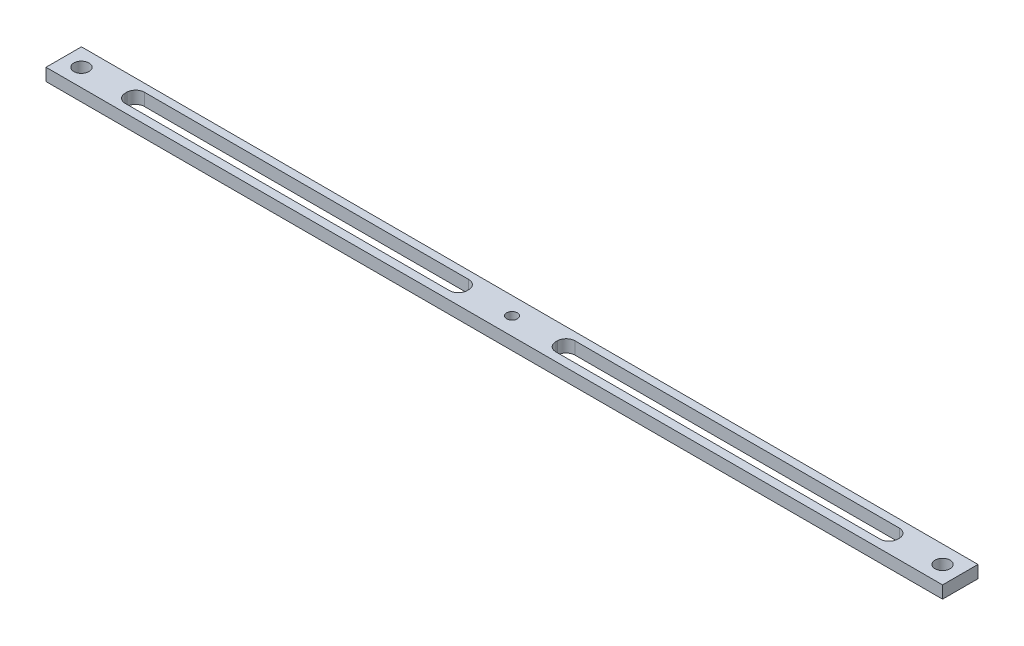
ISO-10303-21;
HEADER;
FILE_DESCRIPTION(('STEP AP214'),'2;1');
FILE_NAME('part.step','',(''),(''),'','','');
FILE_SCHEMA(('AUTOMOTIVE_DESIGN { 1 0 10303 214 1 1 1 1 }'));
ENDSEC;
DATA;
#1=APPLICATION_CONTEXT('core data for automotive mechanical design processes');
#2=APPLICATION_PROTOCOL_DEFINITION('international standard','automotive_design',2000,#1);
#3=PRODUCT_CONTEXT('',#1,'mechanical');
#4=PRODUCT('Part','Part','',(#3));
#5=PRODUCT_RELATED_PRODUCT_CATEGORY('part','',(#4));
#6=PRODUCT_DEFINITION_FORMATION('','',#4);
#7=PRODUCT_DEFINITION_CONTEXT('part definition',#1,'design');
#8=PRODUCT_DEFINITION('design','',#6,#7);
#9=PRODUCT_DEFINITION_SHAPE('','',#8);
#10=(LENGTH_UNIT() NAMED_UNIT(*) SI_UNIT(.MILLI.,.METRE.));
#11=(NAMED_UNIT(*) PLANE_ANGLE_UNIT() SI_UNIT($,.RADIAN.));
#12=(NAMED_UNIT(*) SI_UNIT($,.STERADIAN.) SOLID_ANGLE_UNIT());
#13=UNCERTAINTY_MEASURE_WITH_UNIT(LENGTH_MEASURE(1.E-05),#10,'distance_accuracy_value','');
#14=(GEOMETRIC_REPRESENTATION_CONTEXT(3) GLOBAL_UNCERTAINTY_ASSIGNED_CONTEXT((#13)) GLOBAL_UNIT_ASSIGNED_CONTEXT((#10,
#11,#12)) REPRESENTATION_CONTEXT('',''));
#15=CARTESIAN_POINT('',(0.,0.,0.));
#16=DIRECTION('',(0.,0.,1.));
#17=DIRECTION('',(1.,0.,0.));
#18=AXIS2_PLACEMENT_3D('',#15,#16,#17);
#19=CARTESIAN_POINT('',(0.,7.,0.));
#20=DIRECTION('',(0.,0.,-1.));
#21=DIRECTION('',(-1.,0.,0.));
#22=AXIS2_PLACEMENT_3D('',#19,#20,#21);
#23=PLANE('',#22);
#24=DIRECTION('',(1.,0.,0.));
#25=VECTOR('',#24,1.);
#26=CARTESIAN_POINT('',(0.,0.,0.));
#27=LINE('',#26,#25);
#28=CARTESIAN_POINT('',(0.,0.,0.));
#29=VERTEX_POINT('',#28);
#30=CARTESIAN_POINT('',(506.,0.,-1.21430643318376E-13));
#31=VERTEX_POINT('',#30);
#32=EDGE_CURVE('E266',#29,#31,#27,.T.);
#33=ORIENTED_EDGE('',*,*,#32,.T.);
#34=DIRECTION('',(0.,-1.,0.));
#35=VECTOR('',#34,1.);
#36=CARTESIAN_POINT('',(506.,7.,-1.21430643318376E-13));
#37=LINE('',#36,#35);
#38=CARTESIAN_POINT('',(506.,7.,-1.21430643318376E-13));
#39=VERTEX_POINT('',#38);
#40=EDGE_CURVE('E11',#39,#31,#37,.T.);
#41=ORIENTED_EDGE('',*,*,#40,.F.);
#42=DIRECTION('',(1.,0.,0.));
#43=VECTOR('',#42,1.);
#44=CARTESIAN_POINT('',(0.,7.,0.));
#45=LINE('',#44,#43);
#46=CARTESIAN_POINT('',(0.,7.,0.));
#47=VERTEX_POINT('',#46);
#48=EDGE_CURVE('E192',#47,#39,#45,.T.);
#49=ORIENTED_EDGE('',*,*,#48,.F.);
#50=DIRECTION('',(0.,-1.,0.));
#51=VECTOR('',#50,1.);
#52=CARTESIAN_POINT('',(0.,7.,0.));
#53=LINE('',#52,#51);
#54=EDGE_CURVE('E60',#47,#29,#53,.T.);
#55=ORIENTED_EDGE('',*,*,#54,.T.);
#56=EDGE_LOOP('',(#33,#41,#49,#55));
#57=FACE_BOUND('',#56,.T.);
#58=ADVANCED_FACE('F41',(#57),#23,.F.);
#59=CARTESIAN_POINT('',(506.,7.,0.));
#60=DIRECTION('',(-1.,0.,0.));
#61=DIRECTION('',(0.,0.,1.));
#62=AXIS2_PLACEMENT_3D('',#59,#60,#61);
#63=PLANE('',#62);
#64=DIRECTION('',(0.,0.,-1.));
#65=VECTOR('',#64,1.);
#66=CARTESIAN_POINT('',(506.,0.,0.));
#67=LINE('',#66,#65);
#68=CARTESIAN_POINT('',(506.,0.,-19.9999999999999));
#69=VERTEX_POINT('',#68);
#70=EDGE_CURVE('E198',#31,#69,#67,.T.);
#71=ORIENTED_EDGE('',*,*,#70,.T.);
#72=DIRECTION('',(0.,-1.,0.));
#73=VECTOR('',#72,1.);
#74=CARTESIAN_POINT('',(506.,7.,-19.9999999999999));
#75=LINE('',#74,#73);
#76=CARTESIAN_POINT('',(506.,7.,-19.9999999999999));
#77=VERTEX_POINT('',#76);
#78=EDGE_CURVE('E51',#77,#69,#75,.T.);
#79=ORIENTED_EDGE('',*,*,#78,.F.);
#80=DIRECTION('',(0.,0.,-1.));
#81=VECTOR('',#80,1.);
#82=CARTESIAN_POINT('',(506.,7.,0.));
#83=LINE('',#82,#81);
#84=EDGE_CURVE('E186',#39,#77,#83,.T.);
#85=ORIENTED_EDGE('',*,*,#84,.F.);
#86=ORIENTED_EDGE('',*,*,#40,.T.);
#87=EDGE_LOOP('',(#71,#79,#85,#86));
#88=FACE_BOUND('',#87,.T.);
#89=ADVANCED_FACE('F197',(#88),#63,.F.);
#90=CARTESIAN_POINT('',(0.,7.,-20.));
#91=DIRECTION('',(0.,0.,-1.));
#92=DIRECTION('',(-1.,0.,0.));
#93=AXIS2_PLACEMENT_3D('',#90,#91,#92);
#94=PLANE('',#93);
#95=DIRECTION('',(1.,0.,0.));
#96=VECTOR('',#95,1.);
#97=CARTESIAN_POINT('',(0.,0.,-20.));
#98=LINE('',#97,#96);
#99=CARTESIAN_POINT('',(0.,0.,-20.));
#100=VERTEX_POINT('',#99);
#101=EDGE_CURVE('E269',#100,#69,#98,.T.);
#102=ORIENTED_EDGE('',*,*,#101,.F.);
#103=DIRECTION('',(0.,-1.,0.));
#104=VECTOR('',#103,1.);
#105=CARTESIAN_POINT('',(0.,7.,-20.));
#106=LINE('',#105,#104);
#107=CARTESIAN_POINT('',(0.,7.,-20.));
#108=VERTEX_POINT('',#107);
#109=EDGE_CURVE('E122',#108,#100,#106,.T.);
#110=ORIENTED_EDGE('',*,*,#109,.F.);
#111=DIRECTION('',(1.,0.,0.));
#112=VECTOR('',#111,1.);
#113=CARTESIAN_POINT('',(0.,7.,-20.));
#114=LINE('',#113,#112);
#115=EDGE_CURVE('E191',#108,#77,#114,.T.);
#116=ORIENTED_EDGE('',*,*,#115,.T.);
#117=ORIENTED_EDGE('',*,*,#78,.T.);
#118=EDGE_LOOP('',(#102,#110,#116,#117));
#119=FACE_BOUND('',#118,.T.);
#120=ADVANCED_FACE('F202',(#119),#94,.T.);
#121=CARTESIAN_POINT('',(283.,7.,-10.574576279988));
#122=DIRECTION('',(0.,-1.,0.));
#123=DIRECTION('',(0.,0.,-1.));
#124=AXIS2_PLACEMENT_3D('',#121,#122,#123);
#125=CYLINDRICAL_SURFACE('',#124,5.);
#126=CARTESIAN_POINT('',(283.,0.,-10.574576279988));
#127=DIRECTION('',(0.,1.,0.));
#128=DIRECTION('',(0.,0.,1.));
#129=AXIS2_PLACEMENT_3D('',#126,#127,#128);
#130=CIRCLE('',#129,5.);
#131=CARTESIAN_POINT('',(283.,0.,-15.574576279988));
#132=VERTEX_POINT('',#131);
#133=CARTESIAN_POINT('',(278.,0.,-10.574576279988));
#134=VERTEX_POINT('',#133);
#135=EDGE_CURVE('E242',#132,#134,#130,.T.);
#136=ORIENTED_EDGE('',*,*,#135,.F.);
#137=DIRECTION('',(0.,-1.,0.));
#138=VECTOR('',#137,1.);
#139=CARTESIAN_POINT('',(283.,7.,-15.574576279988));
#140=LINE('',#139,#138);
#141=CARTESIAN_POINT('',(283.,7.,-15.574576279988));
#142=VERTEX_POINT('',#141);
#143=EDGE_CURVE('E276',#142,#132,#140,.T.);
#144=ORIENTED_EDGE('',*,*,#143,.F.);
#145=CARTESIAN_POINT('',(283.,7.,-10.574576279988));
#146=DIRECTION('',(0.,1.,0.));
#147=DIRECTION('',(0.,0.,1.));
#148=AXIS2_PLACEMENT_3D('',#145,#146,#147);
#149=CIRCLE('',#148,5.);
#150=CARTESIAN_POINT('',(278.,7.,-10.574576279988));
#151=VERTEX_POINT('',#150);
#152=EDGE_CURVE('E362',#142,#151,#149,.T.);
#153=ORIENTED_EDGE('',*,*,#152,.T.);
#154=DIRECTION('',(0.,-1.,0.));
#155=VECTOR('',#154,1.);
#156=CARTESIAN_POINT('',(278.,7.,-10.574576279988));
#157=LINE('',#156,#155);
#158=EDGE_CURVE('E278',#151,#134,#157,.T.);
#159=ORIENTED_EDGE('',*,*,#158,.T.);
#160=EDGE_LOOP('',(#136,#144,#153,#159));
#161=FACE_BOUND('',#160,.T.);
#162=ADVANCED_FACE('F399',(#161),#125,.F.);
#163=CARTESIAN_POINT('',(0.,7.,-15.574576279988));
#164=DIRECTION('',(0.,0.,-1.));
#165=DIRECTION('',(-1.,0.,0.));
#166=AXIS2_PLACEMENT_3D('',#163,#164,#165);
#167=PLANE('',#166);
#168=DIRECTION('',(1.,0.,0.));
#169=VECTOR('',#168,1.);
#170=CARTESIAN_POINT('',(0.,0.,-15.574576279988));
#171=LINE('',#170,#169);
#172=CARTESIAN_POINT('',(466.,0.,-15.574576279988));
#173=VERTEX_POINT('',#172);
#174=EDGE_CURVE('E245',#132,#173,#171,.T.);
#175=ORIENTED_EDGE('',*,*,#174,.T.);
#176=DIRECTION('',(0.,-1.,0.));
#177=VECTOR('',#176,1.);
#178=CARTESIAN_POINT('',(466.,7.,-15.574576279988));
#179=LINE('',#178,#177);
#180=CARTESIAN_POINT('',(466.,7.,-15.574576279988));
#181=VERTEX_POINT('',#180);
#182=EDGE_CURVE('E290',#181,#173,#179,.T.);
#183=ORIENTED_EDGE('',*,*,#182,.F.);
#184=DIRECTION('',(1.,0.,0.));
#185=VECTOR('',#184,1.);
#186=CARTESIAN_POINT('',(0.,7.,-15.574576279988));
#187=LINE('',#186,#185);
#188=EDGE_CURVE('E365',#142,#181,#187,.T.);
#189=ORIENTED_EDGE('',*,*,#188,.F.);
#190=ORIENTED_EDGE('',*,*,#143,.T.);
#191=EDGE_LOOP('',(#175,#183,#189,#190));
#192=FACE_BOUND('',#191,.T.);
#193=ADVANCED_FACE('F403',(#192),#167,.F.);
#194=CARTESIAN_POINT('',(466.,7.,-10.574576279988));
#195=DIRECTION('',(0.,-1.,0.));
#196=DIRECTION('',(0.,0.,-1.));
#197=AXIS2_PLACEMENT_3D('',#194,#195,#196);
#198=CYLINDRICAL_SURFACE('',#197,5.);
#199=CARTESIAN_POINT('',(466.,0.,-10.574576279988));
#200=DIRECTION('',(0.,1.,0.));
#201=DIRECTION('',(0.,0.,1.));
#202=AXIS2_PLACEMENT_3D('',#199,#200,#201);
#203=CIRCLE('',#202,5.);
#204=CARTESIAN_POINT('',(471.,0.,-10.574576279988));
#205=VERTEX_POINT('',#204);
#206=EDGE_CURVE('E248',#205,#173,#203,.T.);
#207=ORIENTED_EDGE('',*,*,#206,.F.);
#208=DIRECTION('',(0.,-1.,0.));
#209=VECTOR('',#208,1.);
#210=CARTESIAN_POINT('',(471.,7.,-10.574576279988));
#211=LINE('',#210,#209);
#212=CARTESIAN_POINT('',(471.,7.,-10.574576279988));
#213=VERTEX_POINT('',#212);
#214=EDGE_CURVE('E288',#213,#205,#211,.T.);
#215=ORIENTED_EDGE('',*,*,#214,.F.);
#216=CARTESIAN_POINT('',(466.,7.,-10.574576279988));
#217=DIRECTION('',(0.,1.,0.));
#218=DIRECTION('',(0.,0.,1.));
#219=AXIS2_PLACEMENT_3D('',#216,#217,#218);
#220=CIRCLE('',#219,5.);
#221=EDGE_CURVE('E367',#213,#181,#220,.T.);
#222=ORIENTED_EDGE('',*,*,#221,.T.);
#223=ORIENTED_EDGE('',*,*,#182,.T.);
#224=EDGE_LOOP('',(#207,#215,#222,#223));
#225=FACE_BOUND('',#224,.T.);
#226=ADVANCED_FACE('F409',(#225),#198,.F.);
#227=CARTESIAN_POINT('',(471.,7.,0.));
#228=DIRECTION('',(1.,0.,0.));
#229=DIRECTION('',(0.,0.,-1.));
#230=AXIS2_PLACEMENT_3D('',#227,#228,#229);
#231=PLANE('',#230);
#232=DIRECTION('',(0.,0.,1.));
#233=VECTOR('',#232,1.);
#234=CARTESIAN_POINT('',(471.,0.,0.));
#235=LINE('',#234,#233);
#236=CARTESIAN_POINT('',(471.,0.,-9.75277634577939));
#237=VERTEX_POINT('',#236);
#238=EDGE_CURVE('E251',#205,#237,#235,.T.);
#239=ORIENTED_EDGE('',*,*,#238,.T.);
#240=DIRECTION('',(0.,-1.,0.));
#241=VECTOR('',#240,1.);
#242=CARTESIAN_POINT('',(471.,7.,-9.75277634577939));
#243=LINE('',#242,#241);
#244=CARTESIAN_POINT('',(471.,7.,-9.75277634577939));
#245=VERTEX_POINT('',#244);
#246=EDGE_CURVE('E286',#245,#237,#243,.T.);
#247=ORIENTED_EDGE('',*,*,#246,.F.);
#248=DIRECTION('',(0.,0.,1.));
#249=VECTOR('',#248,1.);
#250=CARTESIAN_POINT('',(471.,7.,0.));
#251=LINE('',#250,#249);
#252=EDGE_CURVE('E370',#213,#245,#251,.T.);
#253=ORIENTED_EDGE('',*,*,#252,.F.);
#254=ORIENTED_EDGE('',*,*,#214,.T.);
#255=EDGE_LOOP('',(#239,#247,#253,#254));
#256=FACE_BOUND('',#255,.T.);
#257=ADVANCED_FACE('F412',(#256),#231,.F.);
#258=CARTESIAN_POINT('',(466.,7.,-9.75277634577939));
#259=DIRECTION('',(0.,-1.,0.));
#260=DIRECTION('',(0.,0.,-1.));
#261=AXIS2_PLACEMENT_3D('',#258,#259,#260);
#262=CYLINDRICAL_SURFACE('',#261,5.);
#263=CARTESIAN_POINT('',(466.,0.,-9.75277634577939));
#264=DIRECTION('',(0.,1.,0.));
#265=DIRECTION('',(0.,0.,1.));
#266=AXIS2_PLACEMENT_3D('',#263,#264,#265);
#267=CIRCLE('',#266,5.);
#268=CARTESIAN_POINT('',(466.,0.,-4.75277634577939));
#269=VERTEX_POINT('',#268);
#270=EDGE_CURVE('E254',#269,#237,#267,.T.);
#271=ORIENTED_EDGE('',*,*,#270,.F.);
#272=DIRECTION('',(0.,-1.,0.));
#273=VECTOR('',#272,1.);
#274=CARTESIAN_POINT('',(466.,7.,-4.75277634577939));
#275=LINE('',#274,#273);
#276=CARTESIAN_POINT('',(466.,7.,-4.75277634577939));
#277=VERTEX_POINT('',#276);
#278=EDGE_CURVE('E284',#277,#269,#275,.T.);
#279=ORIENTED_EDGE('',*,*,#278,.F.);
#280=CARTESIAN_POINT('',(466.,7.,-9.75277634577939));
#281=DIRECTION('',(0.,1.,0.));
#282=DIRECTION('',(0.,0.,1.));
#283=AXIS2_PLACEMENT_3D('',#280,#281,#282);
#284=CIRCLE('',#283,5.);
#285=EDGE_CURVE('E372',#277,#245,#284,.T.);
#286=ORIENTED_EDGE('',*,*,#285,.T.);
#287=ORIENTED_EDGE('',*,*,#246,.T.);
#288=EDGE_LOOP('',(#271,#279,#286,#287));
#289=FACE_BOUND('',#288,.T.);
#290=ADVANCED_FACE('F415',(#289),#262,.F.);
#291=CARTESIAN_POINT('',(0.,7.,-4.75277634577941));
#292=DIRECTION('',(0.,0.,-1.));
#293=DIRECTION('',(-1.,0.,0.));
#294=AXIS2_PLACEMENT_3D('',#291,#292,#293);
#295=PLANE('',#294);
#296=DIRECTION('',(1.,0.,0.));
#297=VECTOR('',#296,1.);
#298=CARTESIAN_POINT('',(0.,0.,-4.75277634577941));
#299=LINE('',#298,#297);
#300=CARTESIAN_POINT('',(283.,0.,-4.7527763457794));
#301=VERTEX_POINT('',#300);
#302=EDGE_CURVE('E257',#301,#269,#299,.T.);
#303=ORIENTED_EDGE('',*,*,#302,.F.);
#304=DIRECTION('',(0.,-1.,0.));
#305=VECTOR('',#304,1.);
#306=CARTESIAN_POINT('',(283.,7.,-4.7527763457794));
#307=LINE('',#306,#305);
#308=CARTESIAN_POINT('',(283.,7.,-4.7527763457794));
#309=VERTEX_POINT('',#308);
#310=EDGE_CURVE('E282',#309,#301,#307,.T.);
#311=ORIENTED_EDGE('',*,*,#310,.F.);
#312=DIRECTION('',(1.,0.,0.));
#313=VECTOR('',#312,1.);
#314=CARTESIAN_POINT('',(0.,7.,-4.75277634577941));
#315=LINE('',#314,#313);
#316=EDGE_CURVE('E375',#309,#277,#315,.T.);
#317=ORIENTED_EDGE('',*,*,#316,.T.);
#318=ORIENTED_EDGE('',*,*,#278,.T.);
#319=EDGE_LOOP('',(#303,#311,#317,#318));
#320=FACE_BOUND('',#319,.T.);
#321=ADVANCED_FACE('F417',(#320),#295,.T.);
#322=CARTESIAN_POINT('',(283.,7.,-9.7527763457794));
#323=DIRECTION('',(0.,-1.,0.));
#324=DIRECTION('',(0.,0.,-1.));
#325=AXIS2_PLACEMENT_3D('',#322,#323,#324);
#326=CYLINDRICAL_SURFACE('',#325,5.);
#327=CARTESIAN_POINT('',(283.,0.,-9.7527763457794));
#328=DIRECTION('',(0.,1.,0.));
#329=DIRECTION('',(0.,0.,1.));
#330=AXIS2_PLACEMENT_3D('',#327,#328,#329);
#331=CIRCLE('',#330,5.);
#332=CARTESIAN_POINT('',(278.,0.,-9.7527763457794));
#333=VERTEX_POINT('',#332);
#334=EDGE_CURVE('E260',#301,#333,#331,.F.);
#335=ORIENTED_EDGE('',*,*,#334,.T.);
#336=DIRECTION('',(0.,-1.,0.));
#337=VECTOR('',#336,1.);
#338=CARTESIAN_POINT('',(278.,7.,-9.7527763457794));
#339=LINE('',#338,#337);
#340=CARTESIAN_POINT('',(278.,7.,-9.7527763457794));
#341=VERTEX_POINT('',#340);
#342=EDGE_CURVE('E280',#341,#333,#339,.T.);
#343=ORIENTED_EDGE('',*,*,#342,.F.);
#344=CARTESIAN_POINT('',(283.,7.,-9.7527763457794));
#345=DIRECTION('',(0.,1.,0.));
#346=DIRECTION('',(0.,0.,1.));
#347=AXIS2_PLACEMENT_3D('',#344,#345,#346);
#348=CIRCLE('',#347,5.);
#349=EDGE_CURVE('E378',#309,#341,#348,.F.);
#350=ORIENTED_EDGE('',*,*,#349,.F.);
#351=ORIENTED_EDGE('',*,*,#310,.T.);
#352=EDGE_LOOP('',(#335,#343,#350,#351));
#353=FACE_BOUND('',#352,.T.);
#354=ADVANCED_FACE('F392',(#353),#326,.F.);
#355=CARTESIAN_POINT('',(40.,7.,-10.5745762799879));
#356=DIRECTION('',(0.,-1.,0.));
#357=DIRECTION('',(0.,0.,-1.));
#358=AXIS2_PLACEMENT_3D('',#355,#356,#357);
#359=CYLINDRICAL_SURFACE('',#358,4.99999999999999);
#360=CARTESIAN_POINT('',(40.,0.,-10.5745762799879));
#361=DIRECTION('',(0.,1.,0.));
#362=DIRECTION('',(0.,0.,1.));
#363=AXIS2_PLACEMENT_3D('',#360,#361,#362);
#364=CIRCLE('',#363,4.99999999999999);
#365=CARTESIAN_POINT('',(40.,0.,-15.5745762799879));
#366=VERTEX_POINT('',#365);
#367=CARTESIAN_POINT('',(35.,0.,-10.5745762799879));
#368=VERTEX_POINT('',#367);
#369=EDGE_CURVE('E218',#366,#368,#364,.T.);
#370=ORIENTED_EDGE('',*,*,#369,.F.);
#371=DIRECTION('',(0.,-1.,0.));
#372=VECTOR('',#371,1.);
#373=CARTESIAN_POINT('',(40.,7.,-15.5745762799879));
#374=LINE('',#373,#372);
#375=CARTESIAN_POINT('',(40.,7.,-15.5745762799879));
#376=VERTEX_POINT('',#375);
#377=EDGE_CURVE('E45',#376,#366,#374,.T.);
#378=ORIENTED_EDGE('',*,*,#377,.F.);
#379=CARTESIAN_POINT('',(40.,7.,-10.5745762799879));
#380=DIRECTION('',(0.,1.,0.));
#381=DIRECTION('',(0.,0.,1.));
#382=AXIS2_PLACEMENT_3D('',#379,#380,#381);
#383=CIRCLE('',#382,4.99999999999999);
#384=CARTESIAN_POINT('',(35.,7.,-10.5745762799879));
#385=VERTEX_POINT('',#384);
#386=EDGE_CURVE('E319',#376,#385,#383,.T.);
#387=ORIENTED_EDGE('',*,*,#386,.T.);
#388=DIRECTION('',(0.,-1.,0.));
#389=VECTOR('',#388,1.);
#390=CARTESIAN_POINT('',(35.,7.,-10.5745762799879));
#391=LINE('',#390,#389);
#392=EDGE_CURVE('E205',#385,#368,#391,.T.);
#393=ORIENTED_EDGE('',*,*,#392,.T.);
#394=EDGE_LOOP('',(#370,#378,#387,#393));
#395=FACE_BOUND('',#394,.T.);
#396=ADVANCED_FACE('F318',(#395),#359,.F.);
#397=CARTESIAN_POINT('',(0.,7.,-15.5745762799879));
#398=DIRECTION('',(0.,0.,-1.));
#399=DIRECTION('',(-1.,0.,0.));
#400=AXIS2_PLACEMENT_3D('',#397,#398,#399);
#401=PLANE('',#400);
#402=DIRECTION('',(1.,0.,0.));
#403=VECTOR('',#402,1.);
#404=CARTESIAN_POINT('',(0.,0.,-15.5745762799879));
#405=LINE('',#404,#403);
#406=CARTESIAN_POINT('',(223.,0.,-15.5745762799879));
#407=VERTEX_POINT('',#406);
#408=EDGE_CURVE('E221',#366,#407,#405,.T.);
#409=ORIENTED_EDGE('',*,*,#408,.T.);
#410=DIRECTION('',(0.,-1.,0.));
#411=VECTOR('',#410,1.);
#412=CARTESIAN_POINT('',(223.,7.,-15.5745762799879));
#413=LINE('',#412,#411);
#414=CARTESIAN_POINT('',(223.,7.,-15.5745762799879));
#415=VERTEX_POINT('',#414);
#416=EDGE_CURVE('E303',#415,#407,#413,.T.);
#417=ORIENTED_EDGE('',*,*,#416,.F.);
#418=DIRECTION('',(1.,0.,0.));
#419=VECTOR('',#418,1.);
#420=CARTESIAN_POINT('',(0.,7.,-15.5745762799879));
#421=LINE('',#420,#419);
#422=EDGE_CURVE('E311',#376,#415,#421,.T.);
#423=ORIENTED_EDGE('',*,*,#422,.F.);
#424=ORIENTED_EDGE('',*,*,#377,.T.);
#425=EDGE_LOOP('',(#409,#417,#423,#424));
#426=FACE_BOUND('',#425,.T.);
#427=ADVANCED_FACE('F310',(#426),#401,.F.);
#428=CARTESIAN_POINT('',(223.,7.,-10.5745762799879));
#429=DIRECTION('',(0.,-1.,0.));
#430=DIRECTION('',(0.,0.,-1.));
#431=AXIS2_PLACEMENT_3D('',#428,#429,#430);
#432=CYLINDRICAL_SURFACE('',#431,5.);
#433=CARTESIAN_POINT('',(223.,0.,-10.5745762799879));
#434=DIRECTION('',(0.,1.,0.));
#435=DIRECTION('',(0.,0.,1.));
#436=AXIS2_PLACEMENT_3D('',#433,#434,#435);
#437=CIRCLE('',#436,5.);
#438=CARTESIAN_POINT('',(228.,0.,-10.5745762799879));
#439=VERTEX_POINT('',#438);
#440=EDGE_CURVE('E224',#439,#407,#437,.T.);
#441=ORIENTED_EDGE('',*,*,#440,.F.);
#442=DIRECTION('',(0.,-1.,0.));
#443=VECTOR('',#442,1.);
#444=CARTESIAN_POINT('',(228.,7.,-10.5745762799879));
#445=LINE('',#444,#443);
#446=CARTESIAN_POINT('',(228.,7.,-10.5745762799879));
#447=VERTEX_POINT('',#446);
#448=EDGE_CURVE('E302',#447,#439,#445,.T.);
#449=ORIENTED_EDGE('',*,*,#448,.F.);
#450=CARTESIAN_POINT('',(223.,7.,-10.5745762799879));
#451=DIRECTION('',(0.,1.,0.));
#452=DIRECTION('',(0.,0.,1.));
#453=AXIS2_PLACEMENT_3D('',#450,#451,#452);
#454=CIRCLE('',#453,5.);
#455=EDGE_CURVE('E347',#447,#415,#454,.T.);
#456=ORIENTED_EDGE('',*,*,#455,.T.);
#457=ORIENTED_EDGE('',*,*,#416,.T.);
#458=EDGE_LOOP('',(#441,#449,#456,#457));
#459=FACE_BOUND('',#458,.T.);
#460=ADVANCED_FACE('F344',(#459),#432,.F.);
#461=CARTESIAN_POINT('',(228.,7.,7.20877313155194E-12));
#462=DIRECTION('',(1.,0.,0.));
#463=DIRECTION('',(0.,0.,-1.));
#464=AXIS2_PLACEMENT_3D('',#461,#462,#463);
#465=PLANE('',#464);
#466=DIRECTION('',(0.,0.,1.));
#467=VECTOR('',#466,1.);
#468=CARTESIAN_POINT('',(228.,0.,7.20877313155194E-12));
#469=LINE('',#468,#467);
#470=CARTESIAN_POINT('',(228.,0.,-9.69671937911455));
#471=VERTEX_POINT('',#470);
#472=EDGE_CURVE('E227',#439,#471,#469,.T.);
#473=ORIENTED_EDGE('',*,*,#472,.T.);
#474=DIRECTION('',(0.,-1.,0.));
#475=VECTOR('',#474,1.);
#476=CARTESIAN_POINT('',(228.,7.,-9.69671937911455));
#477=LINE('',#476,#475);
#478=CARTESIAN_POINT('',(228.,7.,-9.69671937911455));
#479=VERTEX_POINT('',#478);
#480=EDGE_CURVE('E300',#479,#471,#477,.T.);
#481=ORIENTED_EDGE('',*,*,#480,.F.);
#482=DIRECTION('',(0.,0.,1.));
#483=VECTOR('',#482,1.);
#484=CARTESIAN_POINT('',(228.,7.,7.20877313155194E-12));
#485=LINE('',#484,#483);
#486=EDGE_CURVE('E348',#447,#479,#485,.T.);
#487=ORIENTED_EDGE('',*,*,#486,.F.);
#488=ORIENTED_EDGE('',*,*,#448,.T.);
#489=EDGE_LOOP('',(#473,#481,#487,#488));
#490=FACE_BOUND('',#489,.T.);
#491=ADVANCED_FACE('F349',(#490),#465,.F.);
#492=CARTESIAN_POINT('',(223.,7.,-9.69671937911455));
#493=DIRECTION('',(0.,-1.,0.));
#494=DIRECTION('',(0.,0.,-1.));
#495=AXIS2_PLACEMENT_3D('',#492,#493,#494);
#496=CYLINDRICAL_SURFACE('',#495,5.);
#497=CARTESIAN_POINT('',(223.,0.,-9.69671937911455));
#498=DIRECTION('',(0.,1.,0.));
#499=DIRECTION('',(0.,0.,1.));
#500=AXIS2_PLACEMENT_3D('',#497,#498,#499);
#501=CIRCLE('',#500,5.);
#502=CARTESIAN_POINT('',(223.,0.,-4.69671937911455));
#503=VERTEX_POINT('',#502);
#504=EDGE_CURVE('E230',#503,#471,#501,.T.);
#505=ORIENTED_EDGE('',*,*,#504,.F.);
#506=DIRECTION('',(0.,-1.,0.));
#507=VECTOR('',#506,1.);
#508=CARTESIAN_POINT('',(223.,7.,-4.69671937911455));
#509=LINE('',#508,#507);
#510=CARTESIAN_POINT('',(223.,7.,-4.69671937911455));
#511=VERTEX_POINT('',#510);
#512=EDGE_CURVE('E298',#511,#503,#509,.T.);
#513=ORIENTED_EDGE('',*,*,#512,.F.);
#514=CARTESIAN_POINT('',(223.,7.,-9.69671937911455));
#515=DIRECTION('',(0.,1.,0.));
#516=DIRECTION('',(0.,0.,1.));
#517=AXIS2_PLACEMENT_3D('',#514,#515,#516);
#518=CIRCLE('',#517,5.);
#519=EDGE_CURVE('E351',#511,#479,#518,.T.);
#520=ORIENTED_EDGE('',*,*,#519,.T.);
#521=ORIENTED_EDGE('',*,*,#480,.T.);
#522=EDGE_LOOP('',(#505,#513,#520,#521));
#523=FACE_BOUND('',#522,.T.);
#524=ADVANCED_FACE('F341',(#523),#496,.F.);
#525=CARTESIAN_POINT('',(0.,7.,-4.69671937911455));
#526=DIRECTION('',(0.,0.,-1.));
#527=DIRECTION('',(-1.,0.,0.));
#528=AXIS2_PLACEMENT_3D('',#525,#526,#527);
#529=PLANE('',#528);
#530=DIRECTION('',(1.,0.,0.));
#531=VECTOR('',#530,1.);
#532=CARTESIAN_POINT('',(0.,0.,-4.69671937911455));
#533=LINE('',#532,#531);
#534=CARTESIAN_POINT('',(40.,0.,-4.69671937911455));
#535=VERTEX_POINT('',#534);
#536=EDGE_CURVE('E233',#535,#503,#533,.T.);
#537=ORIENTED_EDGE('',*,*,#536,.F.);
#538=DIRECTION('',(0.,-1.,0.));
#539=VECTOR('',#538,1.);
#540=CARTESIAN_POINT('',(40.,7.,-4.69671937911455));
#541=LINE('',#540,#539);
#542=CARTESIAN_POINT('',(40.,7.,-4.69671937911455));
#543=VERTEX_POINT('',#542);
#544=EDGE_CURVE('E296',#543,#535,#541,.T.);
#545=ORIENTED_EDGE('',*,*,#544,.F.);
#546=DIRECTION('',(1.,0.,0.));
#547=VECTOR('',#546,1.);
#548=CARTESIAN_POINT('',(0.,7.,-4.69671937911455));
#549=LINE('',#548,#547);
#550=EDGE_CURVE('E337',#543,#511,#549,.T.);
#551=ORIENTED_EDGE('',*,*,#550,.T.);
#552=ORIENTED_EDGE('',*,*,#512,.T.);
#553=EDGE_LOOP('',(#537,#545,#551,#552));
#554=FACE_BOUND('',#553,.T.);
#555=ADVANCED_FACE('F335',(#554),#529,.T.);
#556=CARTESIAN_POINT('',(40.,7.,-9.69671937911455));
#557=DIRECTION('',(0.,-1.,0.));
#558=DIRECTION('',(0.,0.,-1.));
#559=AXIS2_PLACEMENT_3D('',#556,#557,#558);
#560=CYLINDRICAL_SURFACE('',#559,5.);
#561=CARTESIAN_POINT('',(40.,0.,-9.69671937911455));
#562=DIRECTION('',(0.,1.,0.));
#563=DIRECTION('',(0.,0.,1.));
#564=AXIS2_PLACEMENT_3D('',#561,#562,#563);
#565=CIRCLE('',#564,5.);
#566=CARTESIAN_POINT('',(35.,0.,-9.69671937911455));
#567=VERTEX_POINT('',#566);
#568=EDGE_CURVE('E236',#567,#535,#565,.T.);
#569=ORIENTED_EDGE('',*,*,#568,.F.);
#570=DIRECTION('',(0.,-1.,0.));
#571=VECTOR('',#570,1.);
#572=CARTESIAN_POINT('',(35.,7.,-9.69671937911455));
#573=LINE('',#572,#571);
#574=CARTESIAN_POINT('',(35.,7.,-9.69671937911455));
#575=VERTEX_POINT('',#574);
#576=EDGE_CURVE('E294',#575,#567,#573,.T.);
#577=ORIENTED_EDGE('',*,*,#576,.F.);
#578=CARTESIAN_POINT('',(40.,7.,-9.69671937911455));
#579=DIRECTION('',(0.,1.,0.));
#580=DIRECTION('',(0.,0.,1.));
#581=AXIS2_PLACEMENT_3D('',#578,#579,#580);
#582=CIRCLE('',#581,5.);
#583=EDGE_CURVE('E331',#575,#543,#582,.T.);
#584=ORIENTED_EDGE('',*,*,#583,.T.);
#585=ORIENTED_EDGE('',*,*,#544,.T.);
#586=EDGE_LOOP('',(#569,#577,#584,#585));
#587=FACE_BOUND('',#586,.T.);
#588=ADVANCED_FACE('F328',(#587),#560,.F.);
#589=CARTESIAN_POINT('',(278.,7.,0.));
#590=DIRECTION('',(1.,0.,0.));
#591=DIRECTION('',(0.,0.,-1.));
#592=AXIS2_PLACEMENT_3D('',#589,#590,#591);
#593=PLANE('',#592);
#594=DIRECTION('',(0.,0.,1.));
#595=VECTOR('',#594,1.);
#596=CARTESIAN_POINT('',(278.,0.,0.));
#597=LINE('',#596,#595);
#598=EDGE_CURVE('E263',#134,#333,#597,.T.);
#599=ORIENTED_EDGE('',*,*,#598,.F.);
#600=ORIENTED_EDGE('',*,*,#158,.F.);
#601=DIRECTION('',(0.,0.,1.));
#602=VECTOR('',#601,1.);
#603=CARTESIAN_POINT('',(278.,7.,0.));
#604=LINE('',#603,#602);
#605=EDGE_CURVE('E380',#151,#341,#604,.T.);
#606=ORIENTED_EDGE('',*,*,#605,.T.);
#607=ORIENTED_EDGE('',*,*,#342,.T.);
#608=EDGE_LOOP('',(#599,#600,#606,#607));
#609=FACE_BOUND('',#608,.T.);
#610=ADVANCED_FACE('F385',(#609),#593,.T.);
#611=CARTESIAN_POINT('',(35.,7.,0.));
#612=DIRECTION('',(1.,0.,0.));
#613=DIRECTION('',(0.,0.,-1.));
#614=AXIS2_PLACEMENT_3D('',#611,#612,#613);
#615=PLANE('',#614);
#616=DIRECTION('',(0.,0.,1.));
#617=VECTOR('',#616,1.);
#618=CARTESIAN_POINT('',(35.,0.,0.));
#619=LINE('',#618,#617);
#620=EDGE_CURVE('E239',#368,#567,#619,.T.);
#621=ORIENTED_EDGE('',*,*,#620,.F.);
#622=ORIENTED_EDGE('',*,*,#392,.F.);
#623=DIRECTION('',(0.,0.,1.));
#624=VECTOR('',#623,1.);
#625=CARTESIAN_POINT('',(35.,7.,0.));
#626=LINE('',#625,#624);
#627=EDGE_CURVE('E324',#385,#575,#626,.T.);
#628=ORIENTED_EDGE('',*,*,#627,.T.);
#629=ORIENTED_EDGE('',*,*,#576,.T.);
#630=EDGE_LOOP('',(#621,#622,#628,#629));
#631=FACE_BOUND('',#630,.T.);
#632=ADVANCED_FACE('F323',(#631),#615,.T.);
#633=CARTESIAN_POINT('',(253.,7.,-9.99999999999996));
#634=DIRECTION('',(0.,-1.,0.));
#635=DIRECTION('',(0.,0.,-1.));
#636=AXIS2_PLACEMENT_3D('',#633,#634,#635);
#637=CYLINDRICAL_SURFACE('',#636,2.99999999999999);
#638=CARTESIAN_POINT('',(253.,7.,-9.99999999999996));
#639=DIRECTION('',(0.,1.,0.));
#640=DIRECTION('',(0.,0.,1.));
#641=AXIS2_PLACEMENT_3D('',#638,#639,#640);
#642=CIRCLE('',#641,2.99999999999999);
#643=CARTESIAN_POINT('',(253.,7.,-6.99999999999997));
#644=VERTEX_POINT('',#643);
#645=EDGE_CURVE('E641',#644,#644,#642,.T.);
#646=ORIENTED_EDGE('',*,*,#645,.T.);
#647=EDGE_LOOP('',(#646));
#648=FACE_BOUND('',#647,.T.);
#649=CARTESIAN_POINT('',(253.,0.,-9.99999999999996));
#650=DIRECTION('',(0.,1.,0.));
#651=DIRECTION('',(0.,0.,1.));
#652=AXIS2_PLACEMENT_3D('',#649,#650,#651);
#653=CIRCLE('',#652,2.99999999999999);
#654=CARTESIAN_POINT('',(253.,0.,-6.99999999999997));
#655=VERTEX_POINT('',#654);
#656=EDGE_CURVE('E215',#655,#655,#653,.T.);
#657=ORIENTED_EDGE('',*,*,#656,.F.);
#658=EDGE_LOOP('',(#657));
#659=FACE_BOUND('',#658,.T.);
#660=ADVANCED_FACE('F439',(#648,#659),#637,.F.);
#661=CARTESIAN_POINT('',(10.,7.,-10.));
#662=DIRECTION('',(0.,-1.,0.));
#663=DIRECTION('',(0.,0.,-1.));
#664=AXIS2_PLACEMENT_3D('',#661,#662,#663);
#665=CYLINDRICAL_SURFACE('',#664,4.25);
#666=CARTESIAN_POINT('',(10.,7.,-10.));
#667=DIRECTION('',(0.,1.,0.));
#668=DIRECTION('',(0.,0.,1.));
#669=AXIS2_PLACEMENT_3D('',#666,#667,#668);
#670=CIRCLE('',#669,4.25);
#671=CARTESIAN_POINT('',(10.,7.,-5.75));
#672=VERTEX_POINT('',#671);
#673=EDGE_CURVE('E471',#672,#672,#670,.T.);
#674=ORIENTED_EDGE('',*,*,#673,.T.);
#675=EDGE_LOOP('',(#674));
#676=FACE_BOUND('',#675,.T.);
#677=CARTESIAN_POINT('',(10.,0.,-10.));
#678=DIRECTION('',(0.,1.,0.));
#679=DIRECTION('',(0.,0.,1.));
#680=AXIS2_PLACEMENT_3D('',#677,#678,#679);
#681=CIRCLE('',#680,4.25);
#682=CARTESIAN_POINT('',(10.,0.,-5.75));
#683=VERTEX_POINT('',#682);
#684=EDGE_CURVE('E212',#683,#683,#681,.T.);
#685=ORIENTED_EDGE('',*,*,#684,.F.);
#686=EDGE_LOOP('',(#685));
#687=FACE_BOUND('',#686,.T.);
#688=ADVANCED_FACE('F459',(#676,#687),#665,.F.);
#689=CARTESIAN_POINT('',(496.,7.,-9.99999999999999));
#690=DIRECTION('',(0.,-1.,0.));
#691=DIRECTION('',(0.,0.,-1.));
#692=AXIS2_PLACEMENT_3D('',#689,#690,#691);
#693=CYLINDRICAL_SURFACE('',#692,4.25);
#694=CARTESIAN_POINT('',(496.,7.,-9.99999999999999));
#695=DIRECTION('',(0.,1.,0.));
#696=DIRECTION('',(0.,0.,1.));
#697=AXIS2_PLACEMENT_3D('',#694,#695,#696);
#698=CIRCLE('',#697,4.25);
#699=CARTESIAN_POINT('',(496.,7.,-5.74999999999999));
#700=VERTEX_POINT('',#699);
#701=EDGE_CURVE('E274',#700,#700,#698,.T.);
#702=ORIENTED_EDGE('',*,*,#701,.T.);
#703=EDGE_LOOP('',(#702));
#704=FACE_BOUND('',#703,.T.);
#705=CARTESIAN_POINT('',(496.,0.,-9.99999999999999));
#706=DIRECTION('',(0.,1.,0.));
#707=DIRECTION('',(0.,0.,1.));
#708=AXIS2_PLACEMENT_3D('',#705,#706,#707);
#709=CIRCLE('',#708,4.25);
#710=CARTESIAN_POINT('',(496.,0.,-5.74999999999999));
#711=VERTEX_POINT('',#710);
#712=EDGE_CURVE('E209',#711,#711,#709,.T.);
#713=ORIENTED_EDGE('',*,*,#712,.F.);
#714=EDGE_LOOP('',(#713));
#715=FACE_BOUND('',#714,.T.);
#716=ADVANCED_FACE('F43',(#704,#715),#693,.F.);
#717=CARTESIAN_POINT('',(0.,7.,0.));
#718=DIRECTION('',(-1.,0.,0.));
#719=DIRECTION('',(0.,0.,1.));
#720=AXIS2_PLACEMENT_3D('',#717,#718,#719);
#721=PLANE('',#720);
#722=DIRECTION('',(0.,0.,-1.));
#723=VECTOR('',#722,1.);
#724=CARTESIAN_POINT('',(0.,0.,0.));
#725=LINE('',#724,#723);
#726=EDGE_CURVE('E271',#29,#100,#725,.T.);
#727=ORIENTED_EDGE('',*,*,#726,.F.);
#728=ORIENTED_EDGE('',*,*,#54,.F.);
#729=DIRECTION('',(0.,0.,-1.));
#730=VECTOR('',#729,1.);
#731=CARTESIAN_POINT('',(0.,7.,0.));
#732=LINE('',#731,#730);
#733=EDGE_CURVE('E203',#47,#108,#732,.T.);
#734=ORIENTED_EDGE('',*,*,#733,.T.);
#735=ORIENTED_EDGE('',*,*,#109,.T.);
#736=EDGE_LOOP('',(#727,#728,#734,#735));
#737=FACE_BOUND('',#736,.T.);
#738=ADVANCED_FACE('F466',(#737),#721,.T.);
#739=CARTESIAN_POINT('',(0.,7.,0.));
#740=DIRECTION('',(0.,1.,0.));
#741=DIRECTION('',(0.,0.,1.));
#742=AXIS2_PLACEMENT_3D('',#739,#740,#741);
#743=PLANE('',#742);
#744=ORIENTED_EDGE('',*,*,#701,.F.);
#745=EDGE_LOOP('',(#744));
#746=FACE_BOUND('',#745,.T.);
#747=ORIENTED_EDGE('',*,*,#673,.F.);
#748=EDGE_LOOP('',(#747));
#749=FACE_BOUND('',#748,.T.);
#750=ORIENTED_EDGE('',*,*,#645,.F.);
#751=EDGE_LOOP('',(#750));
#752=FACE_BOUND('',#751,.T.);
#753=ORIENTED_EDGE('',*,*,#386,.F.);
#754=ORIENTED_EDGE('',*,*,#422,.T.);
#755=ORIENTED_EDGE('',*,*,#455,.F.);
#756=ORIENTED_EDGE('',*,*,#486,.T.);
#757=ORIENTED_EDGE('',*,*,#519,.F.);
#758=ORIENTED_EDGE('',*,*,#550,.F.);
#759=ORIENTED_EDGE('',*,*,#583,.F.);
#760=ORIENTED_EDGE('',*,*,#627,.F.);
#761=EDGE_LOOP('',(#753,#754,#755,#756,#757,#758,#759,#760));
#762=FACE_BOUND('',#761,.T.);
#763=ORIENTED_EDGE('',*,*,#152,.F.);
#764=ORIENTED_EDGE('',*,*,#188,.T.);
#765=ORIENTED_EDGE('',*,*,#221,.F.);
#766=ORIENTED_EDGE('',*,*,#252,.T.);
#767=ORIENTED_EDGE('',*,*,#285,.F.);
#768=ORIENTED_EDGE('',*,*,#316,.F.);
#769=ORIENTED_EDGE('',*,*,#349,.T.);
#770=ORIENTED_EDGE('',*,*,#605,.F.);
#771=EDGE_LOOP('',(#763,#764,#765,#766,#767,#768,#769,#770));
#772=FACE_BOUND('',#771,.T.);
#773=ORIENTED_EDGE('',*,*,#48,.T.);
#774=ORIENTED_EDGE('',*,*,#84,.T.);
#775=ORIENTED_EDGE('',*,*,#115,.F.);
#776=ORIENTED_EDGE('',*,*,#733,.F.);
#777=EDGE_LOOP('',(#773,#774,#775,#776));
#778=FACE_BOUND('',#777,.T.);
#779=ADVANCED_FACE('F188',(#746,#749,#752,#762,#772,#778),#743,.T.);
#780=CARTESIAN_POINT('',(0.,0.,0.));
#781=DIRECTION('',(0.,1.,0.));
#782=DIRECTION('',(0.,0.,1.));
#783=AXIS2_PLACEMENT_3D('',#780,#781,#782);
#784=PLANE('',#783);
#785=ORIENTED_EDGE('',*,*,#712,.T.);
#786=EDGE_LOOP('',(#785));
#787=FACE_BOUND('',#786,.T.);
#788=ORIENTED_EDGE('',*,*,#684,.T.);
#789=EDGE_LOOP('',(#788));
#790=FACE_BOUND('',#789,.T.);
#791=ORIENTED_EDGE('',*,*,#656,.T.);
#792=EDGE_LOOP('',(#791));
#793=FACE_BOUND('',#792,.T.);
#794=ORIENTED_EDGE('',*,*,#369,.T.);
#795=ORIENTED_EDGE('',*,*,#620,.T.);
#796=ORIENTED_EDGE('',*,*,#568,.T.);
#797=ORIENTED_EDGE('',*,*,#536,.T.);
#798=ORIENTED_EDGE('',*,*,#504,.T.);
#799=ORIENTED_EDGE('',*,*,#472,.F.);
#800=ORIENTED_EDGE('',*,*,#440,.T.);
#801=ORIENTED_EDGE('',*,*,#408,.F.);
#802=EDGE_LOOP('',(#794,#795,#796,#797,#798,#799,#800,#801));
#803=FACE_BOUND('',#802,.T.);
#804=ORIENTED_EDGE('',*,*,#135,.T.);
#805=ORIENTED_EDGE('',*,*,#598,.T.);
#806=ORIENTED_EDGE('',*,*,#334,.F.);
#807=ORIENTED_EDGE('',*,*,#302,.T.);
#808=ORIENTED_EDGE('',*,*,#270,.T.);
#809=ORIENTED_EDGE('',*,*,#238,.F.);
#810=ORIENTED_EDGE('',*,*,#206,.T.);
#811=ORIENTED_EDGE('',*,*,#174,.F.);
#812=EDGE_LOOP('',(#804,#805,#806,#807,#808,#809,#810,#811));
#813=FACE_BOUND('',#812,.T.);
#814=ORIENTED_EDGE('',*,*,#32,.F.);
#815=ORIENTED_EDGE('',*,*,#726,.T.);
#816=ORIENTED_EDGE('',*,*,#101,.T.);
#817=ORIENTED_EDGE('',*,*,#70,.F.);
#818=EDGE_LOOP('',(#814,#815,#816,#817));
#819=FACE_BOUND('',#818,.T.);
#820=ADVANCED_FACE('F314',(#787,#790,#793,#803,#813,#819),#784,.F.);
#821=CLOSED_SHELL('',(#58,#89,#120,#162,#193,#226,#257,#290,#321,#354,#396,#427,#460,#491,#524,
#555,#588,#610,#632,#660,#688,#716,#738,#779,#820));
#822=MANIFOLD_SOLID_BREP('B2',#821);
#823=ADVANCED_BREP_SHAPE_REPRESENTATION('',(#18,#822),#14);
#824=SHAPE_DEFINITION_REPRESENTATION(#9,#823);
ENDSEC;
END-ISO-10303-21;
